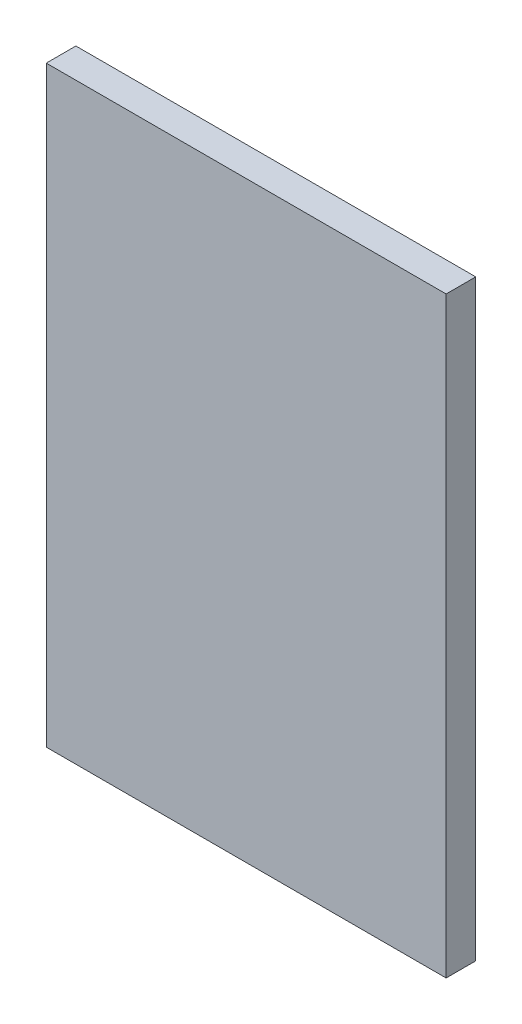
ISO-10303-21;
HEADER;
FILE_DESCRIPTION(('STEP AP214'),'2;1');
FILE_NAME('part.step','',(''),(''),'','','');
FILE_SCHEMA(('AUTOMOTIVE_DESIGN { 1 0 10303 214 1 1 1 1 }'));
ENDSEC;
DATA;
#1=APPLICATION_CONTEXT('core data for automotive mechanical design processes');
#2=APPLICATION_PROTOCOL_DEFINITION('international standard','automotive_design',2000,#1);
#3=PRODUCT_CONTEXT('',#1,'mechanical');
#4=PRODUCT('Part','Part','',(#3));
#5=PRODUCT_RELATED_PRODUCT_CATEGORY('part','',(#4));
#6=PRODUCT_DEFINITION_FORMATION('','',#4);
#7=PRODUCT_DEFINITION_CONTEXT('part definition',#1,'design');
#8=PRODUCT_DEFINITION('design','',#6,#7);
#9=PRODUCT_DEFINITION_SHAPE('','',#8);
#10=(LENGTH_UNIT() NAMED_UNIT(*) SI_UNIT(.MILLI.,.METRE.));
#11=(NAMED_UNIT(*) PLANE_ANGLE_UNIT() SI_UNIT($,.RADIAN.));
#12=(NAMED_UNIT(*) SI_UNIT($,.STERADIAN.) SOLID_ANGLE_UNIT());
#13=UNCERTAINTY_MEASURE_WITH_UNIT(LENGTH_MEASURE(1.E-05),#10,'distance_accuracy_value','');
#14=(GEOMETRIC_REPRESENTATION_CONTEXT(3) GLOBAL_UNCERTAINTY_ASSIGNED_CONTEXT((#13)) GLOBAL_UNIT_ASSIGNED_CONTEXT((#10,
#11,#12)) REPRESENTATION_CONTEXT('',''));
#15=CARTESIAN_POINT('',(0.,0.,0.));
#16=DIRECTION('',(0.,0.,1.));
#17=DIRECTION('',(1.,0.,0.));
#18=AXIS2_PLACEMENT_3D('',#15,#16,#17);
#19=CARTESIAN_POINT('',(-135.,1030.,-135.));
#20=DIRECTION('',(1.,0.,0.));
#21=DIRECTION('',(0.,0.,-1.));
#22=AXIS2_PLACEMENT_3D('',#19,#20,#21);
#23=PLANE('',#22);
#24=DIRECTION('',(0.,0.,1.));
#25=VECTOR('',#24,1.);
#26=CARTESIAN_POINT('',(-135.,630.,-135.));
#27=LINE('',#26,#25);
#28=CARTESIAN_POINT('',(-135.,630.,-155.));
#29=VERTEX_POINT('',#28);
#30=CARTESIAN_POINT('',(-135.,630.,-135.));
#31=VERTEX_POINT('',#30);
#32=EDGE_CURVE('E107',#29,#31,#27,.T.);
#33=ORIENTED_EDGE('',*,*,#32,.T.);
#34=DIRECTION('',(0.,-1.,0.));
#35=VECTOR('',#34,1.);
#36=CARTESIAN_POINT('',(-135.,1030.,-135.));
#37=LINE('',#36,#35);
#38=CARTESIAN_POINT('',(-135.,1030.,-135.));
#39=VERTEX_POINT('',#38);
#40=EDGE_CURVE('E11',#39,#31,#37,.T.);
#41=ORIENTED_EDGE('',*,*,#40,.F.);
#42=DIRECTION('',(0.,0.,1.));
#43=VECTOR('',#42,1.);
#44=CARTESIAN_POINT('',(-135.,1030.,-135.));
#45=LINE('',#44,#43);
#46=CARTESIAN_POINT('',(-135.,1030.,-155.));
#47=VERTEX_POINT('',#46);
#48=EDGE_CURVE('E91',#47,#39,#45,.T.);
#49=ORIENTED_EDGE('',*,*,#48,.F.);
#50=DIRECTION('',(0.,-1.,0.));
#51=VECTOR('',#50,1.);
#52=CARTESIAN_POINT('',(-135.,1030.,-155.));
#53=LINE('',#52,#51);
#54=EDGE_CURVE('E103',#47,#29,#53,.T.);
#55=ORIENTED_EDGE('',*,*,#54,.T.);
#56=EDGE_LOOP('',(#33,#41,#49,#55));
#57=FACE_BOUND('',#56,.T.);
#58=ADVANCED_FACE('F39',(#57),#23,.F.);
#59=CARTESIAN_POINT('',(-135.,1030.,-135.));
#60=DIRECTION('',(0.,0.,-1.));
#61=DIRECTION('',(-1.,0.,0.));
#62=AXIS2_PLACEMENT_3D('',#59,#60,#61);
#63=PLANE('',#62);
#64=DIRECTION('',(1.,0.,0.));
#65=VECTOR('',#64,1.);
#66=CARTESIAN_POINT('',(-135.,630.,-135.));
#67=LINE('',#66,#65);
#68=CARTESIAN_POINT('',(135.,630.,-135.));
#69=VERTEX_POINT('',#68);
#70=EDGE_CURVE('E96',#31,#69,#67,.T.);
#71=ORIENTED_EDGE('',*,*,#70,.T.);
#72=DIRECTION('',(0.,-1.,0.));
#73=VECTOR('',#72,1.);
#74=CARTESIAN_POINT('',(135.,1030.,-135.));
#75=LINE('',#74,#73);
#76=CARTESIAN_POINT('',(135.,1030.,-135.));
#77=VERTEX_POINT('',#76);
#78=EDGE_CURVE('E48',#77,#69,#75,.T.);
#79=ORIENTED_EDGE('',*,*,#78,.F.);
#80=DIRECTION('',(1.,0.,0.));
#81=VECTOR('',#80,1.);
#82=CARTESIAN_POINT('',(-135.,1030.,-135.));
#83=LINE('',#82,#81);
#84=EDGE_CURVE('E86',#39,#77,#83,.T.);
#85=ORIENTED_EDGE('',*,*,#84,.F.);
#86=ORIENTED_EDGE('',*,*,#40,.T.);
#87=EDGE_LOOP('',(#71,#79,#85,#86));
#88=FACE_BOUND('',#87,.T.);
#89=ADVANCED_FACE('F95',(#88),#63,.F.);
#90=CARTESIAN_POINT('',(135.,1030.,-135.));
#91=DIRECTION('',(-1.,0.,0.));
#92=DIRECTION('',(0.,0.,1.));
#93=AXIS2_PLACEMENT_3D('',#90,#91,#92);
#94=PLANE('',#93);
#95=DIRECTION('',(0.,0.,-1.));
#96=VECTOR('',#95,1.);
#97=CARTESIAN_POINT('',(135.,630.,-135.));
#98=LINE('',#97,#96);
#99=CARTESIAN_POINT('',(135.,630.,-155.));
#100=VERTEX_POINT('',#99);
#101=EDGE_CURVE('E73',#69,#100,#98,.T.);
#102=ORIENTED_EDGE('',*,*,#101,.T.);
#103=DIRECTION('',(0.,-1.,0.));
#104=VECTOR('',#103,1.);
#105=CARTESIAN_POINT('',(135.,1030.,-155.));
#106=LINE('',#105,#104);
#107=CARTESIAN_POINT('',(135.,1030.,-155.));
#108=VERTEX_POINT('',#107);
#109=EDGE_CURVE('E98',#108,#100,#106,.T.);
#110=ORIENTED_EDGE('',*,*,#109,.F.);
#111=DIRECTION('',(0.,0.,-1.));
#112=VECTOR('',#111,1.);
#113=CARTESIAN_POINT('',(135.,1030.,-135.));
#114=LINE('',#113,#112);
#115=EDGE_CURVE('E89',#77,#108,#114,.T.);
#116=ORIENTED_EDGE('',*,*,#115,.F.);
#117=ORIENTED_EDGE('',*,*,#78,.T.);
#118=EDGE_LOOP('',(#102,#110,#116,#117));
#119=FACE_BOUND('',#118,.T.);
#120=ADVANCED_FACE('F99',(#119),#94,.F.);
#121=CARTESIAN_POINT('',(-135.,1030.,-155.));
#122=DIRECTION('',(0.,0.,1.));
#123=DIRECTION('',(1.,0.,0.));
#124=AXIS2_PLACEMENT_3D('',#121,#122,#123);
#125=PLANE('',#124);
#126=DIRECTION('',(-1.,0.,0.));
#127=VECTOR('',#126,1.);
#128=CARTESIAN_POINT('',(-135.,630.,-155.));
#129=LINE('',#128,#127);
#130=EDGE_CURVE('E79',#100,#29,#129,.T.);
#131=ORIENTED_EDGE('',*,*,#130,.T.);
#132=ORIENTED_EDGE('',*,*,#54,.F.);
#133=DIRECTION('',(-1.,0.,0.));
#134=VECTOR('',#133,1.);
#135=CARTESIAN_POINT('',(-135.,1030.,-155.));
#136=LINE('',#135,#134);
#137=EDGE_CURVE('E56',#108,#47,#136,.T.);
#138=ORIENTED_EDGE('',*,*,#137,.F.);
#139=ORIENTED_EDGE('',*,*,#109,.T.);
#140=EDGE_LOOP('',(#131,#132,#138,#139));
#141=FACE_BOUND('',#140,.T.);
#142=ADVANCED_FACE('F120',(#141),#125,.F.);
#143=CARTESIAN_POINT('',(0.,1030.,0.));
#144=DIRECTION('',(0.,-1.,0.));
#145=DIRECTION('',(0.,0.,-1.));
#146=AXIS2_PLACEMENT_3D('',#143,#144,#145);
#147=PLANE('',#146);
#148=ORIENTED_EDGE('',*,*,#48,.T.);
#149=ORIENTED_EDGE('',*,*,#84,.T.);
#150=ORIENTED_EDGE('',*,*,#115,.T.);
#151=ORIENTED_EDGE('',*,*,#137,.T.);
#152=EDGE_LOOP('',(#148,#149,#150,#151));
#153=FACE_BOUND('',#152,.T.);
#154=ADVANCED_FACE('F87',(#153),#147,.F.);
#155=CARTESIAN_POINT('',(0.,630.,0.));
#156=DIRECTION('',(0.,-1.,0.));
#157=DIRECTION('',(0.,0.,-1.));
#158=AXIS2_PLACEMENT_3D('',#155,#156,#157);
#159=PLANE('',#158);
#160=ORIENTED_EDGE('',*,*,#32,.F.);
#161=ORIENTED_EDGE('',*,*,#130,.F.);
#162=ORIENTED_EDGE('',*,*,#101,.F.);
#163=ORIENTED_EDGE('',*,*,#70,.F.);
#164=EDGE_LOOP('',(#160,#161,#162,#163));
#165=FACE_BOUND('',#164,.T.);
#166=ADVANCED_FACE('F123',(#165),#159,.T.);
#167=CLOSED_SHELL('',(#58,#89,#120,#142,#154,#166));
#168=MANIFOLD_SOLID_BREP('B2',#167);
#169=ADVANCED_BREP_SHAPE_REPRESENTATION('',(#18,#168),#14);
#170=SHAPE_DEFINITION_REPRESENTATION(#9,#169);
ENDSEC;
END-ISO-10303-21;
